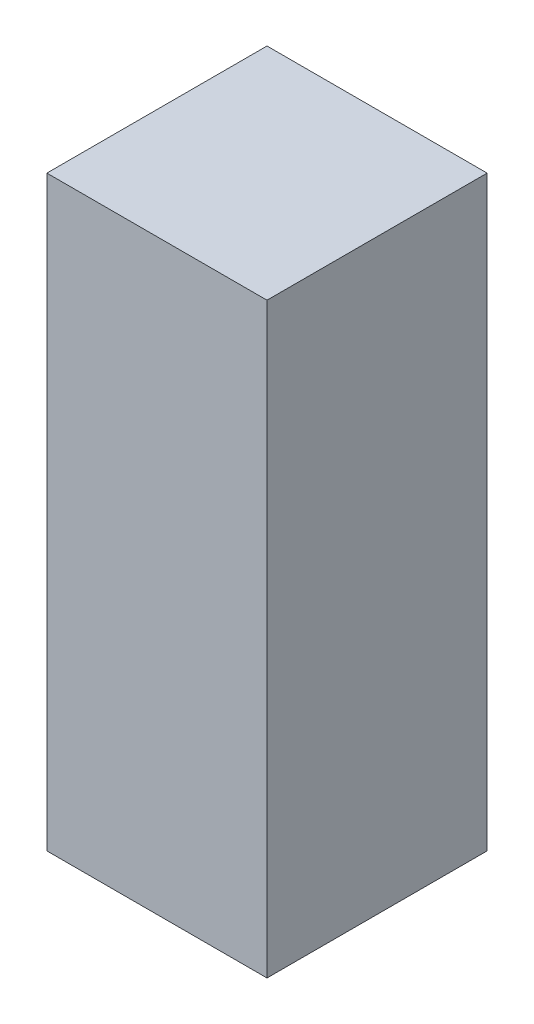
ISO-10303-21;
HEADER;
FILE_DESCRIPTION(('STEP AP214'),'2;1');
FILE_NAME('part.step','',(''),(''),'','','');
FILE_SCHEMA(('AUTOMOTIVE_DESIGN { 1 0 10303 214 1 1 1 1 }'));
ENDSEC;
DATA;
#1=APPLICATION_CONTEXT('core data for automotive mechanical design processes');
#2=APPLICATION_PROTOCOL_DEFINITION('international standard','automotive_design',2000,#1);
#3=PRODUCT_CONTEXT('',#1,'mechanical');
#4=PRODUCT('Part','Part','',(#3));
#5=PRODUCT_RELATED_PRODUCT_CATEGORY('part','',(#4));
#6=PRODUCT_DEFINITION_FORMATION('','',#4);
#7=PRODUCT_DEFINITION_CONTEXT('part definition',#1,'design');
#8=PRODUCT_DEFINITION('design','',#6,#7);
#9=PRODUCT_DEFINITION_SHAPE('','',#8);
#10=(LENGTH_UNIT() NAMED_UNIT(*) SI_UNIT(.MILLI.,.METRE.));
#11=(NAMED_UNIT(*) PLANE_ANGLE_UNIT() SI_UNIT($,.RADIAN.));
#12=(NAMED_UNIT(*) SI_UNIT($,.STERADIAN.) SOLID_ANGLE_UNIT());
#13=UNCERTAINTY_MEASURE_WITH_UNIT(LENGTH_MEASURE(1.E-05),#10,'distance_accuracy_value','');
#14=(GEOMETRIC_REPRESENTATION_CONTEXT(3) GLOBAL_UNCERTAINTY_ASSIGNED_CONTEXT((#13)) GLOBAL_UNIT_ASSIGNED_CONTEXT((#10,
#11,#12)) REPRESENTATION_CONTEXT('',''));
#15=CARTESIAN_POINT('',(0.,0.,0.));
#16=DIRECTION('',(0.,0.,1.));
#17=DIRECTION('',(1.,0.,0.));
#18=AXIS2_PLACEMENT_3D('',#15,#16,#17);
#19=CARTESIAN_POINT('',(0.,203.2,0.));
#20=DIRECTION('',(0.,-1.,0.));
#21=DIRECTION('',(0.,0.,-1.));
#22=AXIS2_PLACEMENT_3D('',#19,#20,#21);
#23=PLANE('',#22);
#24=DIRECTION('',(0.,0.,-1.));
#25=VECTOR('',#24,1.);
#26=CARTESIAN_POINT('',(38.1,203.2,38.1));
#27=LINE('',#26,#25);
#28=CARTESIAN_POINT('',(38.1,203.2,38.1));
#29=VERTEX_POINT('',#28);
#30=CARTESIAN_POINT('',(38.1,203.2,-38.1));
#31=VERTEX_POINT('',#30);
#32=EDGE_CURVE('E134',#29,#31,#27,.T.);
#33=ORIENTED_EDGE('',*,*,#32,.T.);
#34=DIRECTION('',(-1.,0.,0.));
#35=VECTOR('',#34,1.);
#36=CARTESIAN_POINT('',(-38.1,203.2,-38.1));
#37=LINE('',#36,#35);
#38=CARTESIAN_POINT('',(-38.1,203.2,-38.1));
#39=VERTEX_POINT('',#38);
#40=EDGE_CURVE('E137',#31,#39,#37,.T.);
#41=ORIENTED_EDGE('',*,*,#40,.T.);
#42=DIRECTION('',(0.,0.,1.));
#43=VECTOR('',#42,1.);
#44=CARTESIAN_POINT('',(-38.1,203.2,38.1));
#45=LINE('',#44,#43);
#46=CARTESIAN_POINT('',(-38.1,203.2,38.1));
#47=VERTEX_POINT('',#46);
#48=EDGE_CURVE('E140',#39,#47,#45,.T.);
#49=ORIENTED_EDGE('',*,*,#48,.T.);
#50=DIRECTION('',(1.,0.,0.));
#51=VECTOR('',#50,1.);
#52=CARTESIAN_POINT('',(-38.1,203.2,38.1));
#53=LINE('',#52,#51);
#54=EDGE_CURVE('E142',#47,#29,#53,.T.);
#55=ORIENTED_EDGE('',*,*,#54,.T.);
#56=EDGE_LOOP('',(#33,#41,#49,#55));
#57=FACE_BOUND('',#56,.T.);
#58=ADVANCED_FACE('F33',(#57),#23,.F.);
#59=CARTESIAN_POINT('',(0.,0.,0.));
#60=DIRECTION('',(0.,-1.,0.));
#61=DIRECTION('',(0.,0.,-1.));
#62=AXIS2_PLACEMENT_3D('',#59,#60,#61);
#63=PLANE('',#62);
#64=DIRECTION('',(0.,0.,-1.));
#65=VECTOR('',#64,1.);
#66=CARTESIAN_POINT('',(38.1,0.,38.1));
#67=LINE('',#66,#65);
#68=CARTESIAN_POINT('',(38.1,0.,38.1));
#69=VERTEX_POINT('',#68);
#70=CARTESIAN_POINT('',(38.1,0.,-38.1));
#71=VERTEX_POINT('',#70);
#72=EDGE_CURVE('E133',#69,#71,#67,.T.);
#73=ORIENTED_EDGE('',*,*,#72,.F.);
#74=DIRECTION('',(1.,0.,0.));
#75=VECTOR('',#74,1.);
#76=CARTESIAN_POINT('',(-38.1,0.,38.1));
#77=LINE('',#76,#75);
#78=CARTESIAN_POINT('',(-38.1,0.,38.1));
#79=VERTEX_POINT('',#78);
#80=EDGE_CURVE('E138',#79,#69,#77,.T.);
#81=ORIENTED_EDGE('',*,*,#80,.F.);
#82=DIRECTION('',(0.,0.,1.));
#83=VECTOR('',#82,1.);
#84=CARTESIAN_POINT('',(-38.1,0.,38.1));
#85=LINE('',#84,#83);
#86=CARTESIAN_POINT('',(-38.1,0.,-38.1));
#87=VERTEX_POINT('',#86);
#88=EDGE_CURVE('E149',#87,#79,#85,.T.);
#89=ORIENTED_EDGE('',*,*,#88,.F.);
#90=DIRECTION('',(-1.,0.,0.));
#91=VECTOR('',#90,1.);
#92=CARTESIAN_POINT('',(-38.1,0.,-38.1));
#93=LINE('',#92,#91);
#94=EDGE_CURVE('E147',#71,#87,#93,.T.);
#95=ORIENTED_EDGE('',*,*,#94,.F.);
#96=EDGE_LOOP('',(#73,#81,#89,#95));
#97=FACE_BOUND('',#96,.T.);
#98=DIRECTION('',(1.,0.,0.));
#99=VECTOR('',#98,1.);
#100=CARTESIAN_POINT('',(-36.83,0.,36.83));
#101=LINE('',#100,#99);
#102=CARTESIAN_POINT('',(-36.83,0.,36.83));
#103=VERTEX_POINT('',#102);
#104=CARTESIAN_POINT('',(36.83,0.,36.83));
#105=VERTEX_POINT('',#104);
#106=EDGE_CURVE('E104',#103,#105,#101,.T.);
#107=ORIENTED_EDGE('',*,*,#106,.T.);
#108=DIRECTION('',(0.,0.,-1.));
#109=VECTOR('',#108,1.);
#110=CARTESIAN_POINT('',(36.83,0.,36.83));
#111=LINE('',#110,#109);
#112=CARTESIAN_POINT('',(36.83,0.,-36.83));
#113=VERTEX_POINT('',#112);
#114=EDGE_CURVE('E117',#105,#113,#111,.T.);
#115=ORIENTED_EDGE('',*,*,#114,.T.);
#116=DIRECTION('',(-1.,0.,0.));
#117=VECTOR('',#116,1.);
#118=CARTESIAN_POINT('',(-36.83,0.,-36.83));
#119=LINE('',#118,#117);
#120=CARTESIAN_POINT('',(-36.83,0.,-36.83));
#121=VERTEX_POINT('',#120);
#122=EDGE_CURVE('E120',#113,#121,#119,.T.);
#123=ORIENTED_EDGE('',*,*,#122,.T.);
#124=DIRECTION('',(0.,0.,1.));
#125=VECTOR('',#124,1.);
#126=CARTESIAN_POINT('',(-36.83,0.,36.83));
#127=LINE('',#126,#125);
#128=EDGE_CURVE('E126',#121,#103,#127,.T.);
#129=ORIENTED_EDGE('',*,*,#128,.T.);
#130=EDGE_LOOP('',(#107,#115,#123,#129));
#131=FACE_BOUND('',#130,.T.);
#132=ADVANCED_FACE('F167',(#97,#131),#63,.T.);
#133=CARTESIAN_POINT('',(38.1,203.2,38.1));
#134=DIRECTION('',(-1.,0.,0.));
#135=DIRECTION('',(0.,0.,1.));
#136=AXIS2_PLACEMENT_3D('',#133,#134,#135);
#137=PLANE('',#136);
#138=ORIENTED_EDGE('',*,*,#72,.T.);
#139=DIRECTION('',(0.,-1.,0.));
#140=VECTOR('',#139,1.);
#141=CARTESIAN_POINT('',(38.1,203.2,-38.1));
#142=LINE('',#141,#140);
#143=EDGE_CURVE('E11',#31,#71,#142,.T.);
#144=ORIENTED_EDGE('',*,*,#143,.F.);
#145=ORIENTED_EDGE('',*,*,#32,.F.);
#146=DIRECTION('',(0.,-1.,0.));
#147=VECTOR('',#146,1.);
#148=CARTESIAN_POINT('',(38.1,203.2,38.1));
#149=LINE('',#148,#147);
#150=EDGE_CURVE('E144',#29,#69,#149,.T.);
#151=ORIENTED_EDGE('',*,*,#150,.T.);
#152=EDGE_LOOP('',(#138,#144,#145,#151));
#153=FACE_BOUND('',#152,.T.);
#154=ADVANCED_FACE('F35',(#153),#137,.F.);
#155=CARTESIAN_POINT('',(-38.1,203.2,-38.1));
#156=DIRECTION('',(0.,0.,1.));
#157=DIRECTION('',(1.,0.,0.));
#158=AXIS2_PLACEMENT_3D('',#155,#156,#157);
#159=PLANE('',#158);
#160=ORIENTED_EDGE('',*,*,#94,.T.);
#161=DIRECTION('',(0.,-1.,0.));
#162=VECTOR('',#161,1.);
#163=CARTESIAN_POINT('',(-38.1,203.2,-38.1));
#164=LINE('',#163,#162);
#165=EDGE_CURVE('E41',#39,#87,#164,.T.);
#166=ORIENTED_EDGE('',*,*,#165,.F.);
#167=ORIENTED_EDGE('',*,*,#40,.F.);
#168=ORIENTED_EDGE('',*,*,#143,.T.);
#169=EDGE_LOOP('',(#160,#166,#167,#168));
#170=FACE_BOUND('',#169,.T.);
#171=ADVANCED_FACE('F177',(#170),#159,.F.);
#172=CARTESIAN_POINT('',(-38.1,203.2,38.1));
#173=DIRECTION('',(1.,0.,0.));
#174=DIRECTION('',(0.,0.,-1.));
#175=AXIS2_PLACEMENT_3D('',#172,#173,#174);
#176=PLANE('',#175);
#177=ORIENTED_EDGE('',*,*,#88,.T.);
#178=DIRECTION('',(0.,-1.,0.));
#179=VECTOR('',#178,1.);
#180=CARTESIAN_POINT('',(-38.1,203.2,38.1));
#181=LINE('',#180,#179);
#182=EDGE_CURVE('E154',#47,#79,#181,.T.);
#183=ORIENTED_EDGE('',*,*,#182,.F.);
#184=ORIENTED_EDGE('',*,*,#48,.F.);
#185=ORIENTED_EDGE('',*,*,#165,.T.);
#186=EDGE_LOOP('',(#177,#183,#184,#185));
#187=FACE_BOUND('',#186,.T.);
#188=ADVANCED_FACE('F161',(#187),#176,.F.);
#189=CARTESIAN_POINT('',(-38.1,203.2,38.1));
#190=DIRECTION('',(0.,0.,-1.));
#191=DIRECTION('',(-1.,0.,0.));
#192=AXIS2_PLACEMENT_3D('',#189,#190,#191);
#193=PLANE('',#192);
#194=ORIENTED_EDGE('',*,*,#80,.T.);
#195=ORIENTED_EDGE('',*,*,#150,.F.);
#196=ORIENTED_EDGE('',*,*,#54,.F.);
#197=ORIENTED_EDGE('',*,*,#182,.T.);
#198=EDGE_LOOP('',(#194,#195,#196,#197));
#199=FACE_BOUND('',#198,.T.);
#200=ADVANCED_FACE('F171',(#199),#193,.F.);
#201=CARTESIAN_POINT('',(36.83,203.2,36.83));
#202=DIRECTION('',(-1.,0.,0.));
#203=DIRECTION('',(0.,0.,1.));
#204=AXIS2_PLACEMENT_3D('',#201,#202,#203);
#205=PLANE('',#204);
#206=DIRECTION('',(0.,0.,-1.));
#207=VECTOR('',#206,1.);
#208=CARTESIAN_POINT('',(36.83,201.93,36.83));
#209=LINE('',#208,#207);
#210=CARTESIAN_POINT('',(36.83,201.93,36.83));
#211=VERTEX_POINT('',#210);
#212=CARTESIAN_POINT('',(36.83,201.93,-36.83));
#213=VERTEX_POINT('',#212);
#214=EDGE_CURVE('E48',#211,#213,#209,.T.);
#215=ORIENTED_EDGE('',*,*,#214,.T.);
#216=DIRECTION('',(0.,-1.,0.));
#217=VECTOR('',#216,1.);
#218=CARTESIAN_POINT('',(36.83,203.2,-36.83));
#219=LINE('',#218,#217);
#220=EDGE_CURVE('E131',#213,#113,#219,.T.);
#221=ORIENTED_EDGE('',*,*,#220,.T.);
#222=ORIENTED_EDGE('',*,*,#114,.F.);
#223=DIRECTION('',(0.,-1.,0.));
#224=VECTOR('',#223,1.);
#225=CARTESIAN_POINT('',(36.83,203.2,36.83));
#226=LINE('',#225,#224);
#227=EDGE_CURVE('E109',#211,#105,#226,.T.);
#228=ORIENTED_EDGE('',*,*,#227,.F.);
#229=EDGE_LOOP('',(#215,#221,#222,#228));
#230=FACE_BOUND('',#229,.T.);
#231=ADVANCED_FACE('F191',(#230),#205,.T.);
#232=CARTESIAN_POINT('',(-36.83,203.2,-36.83));
#233=DIRECTION('',(0.,0.,1.));
#234=DIRECTION('',(1.,0.,0.));
#235=AXIS2_PLACEMENT_3D('',#232,#233,#234);
#236=PLANE('',#235);
#237=DIRECTION('',(-1.,0.,0.));
#238=VECTOR('',#237,1.);
#239=CARTESIAN_POINT('',(-36.83,201.93,-36.83));
#240=LINE('',#239,#238);
#241=CARTESIAN_POINT('',(-36.83,201.93,-36.83));
#242=VERTEX_POINT('',#241);
#243=EDGE_CURVE('E55',#213,#242,#240,.T.);
#244=ORIENTED_EDGE('',*,*,#243,.T.);
#245=DIRECTION('',(0.,-1.,0.));
#246=VECTOR('',#245,1.);
#247=CARTESIAN_POINT('',(-36.83,203.2,-36.83));
#248=LINE('',#247,#246);
#249=EDGE_CURVE('E108',#242,#121,#248,.T.);
#250=ORIENTED_EDGE('',*,*,#249,.T.);
#251=ORIENTED_EDGE('',*,*,#122,.F.);
#252=ORIENTED_EDGE('',*,*,#220,.F.);
#253=EDGE_LOOP('',(#244,#250,#251,#252));
#254=FACE_BOUND('',#253,.T.);
#255=ADVANCED_FACE('F198',(#254),#236,.T.);
#256=CARTESIAN_POINT('',(-36.83,203.2,36.83));
#257=DIRECTION('',(1.,0.,0.));
#258=DIRECTION('',(0.,0.,-1.));
#259=AXIS2_PLACEMENT_3D('',#256,#257,#258);
#260=PLANE('',#259);
#261=DIRECTION('',(0.,0.,1.));
#262=VECTOR('',#261,1.);
#263=CARTESIAN_POINT('',(-36.83,201.93,36.83));
#264=LINE('',#263,#262);
#265=CARTESIAN_POINT('',(-36.83,201.93,36.83));
#266=VERTEX_POINT('',#265);
#267=EDGE_CURVE('E112',#242,#266,#264,.T.);
#268=ORIENTED_EDGE('',*,*,#267,.T.);
#269=DIRECTION('',(0.,-1.,0.));
#270=VECTOR('',#269,1.);
#271=CARTESIAN_POINT('',(-36.83,203.2,36.83));
#272=LINE('',#271,#270);
#273=EDGE_CURVE('E98',#266,#103,#272,.T.);
#274=ORIENTED_EDGE('',*,*,#273,.T.);
#275=ORIENTED_EDGE('',*,*,#128,.F.);
#276=ORIENTED_EDGE('',*,*,#249,.F.);
#277=EDGE_LOOP('',(#268,#274,#275,#276));
#278=FACE_BOUND('',#277,.T.);
#279=ADVANCED_FACE('F113',(#278),#260,.T.);
#280=CARTESIAN_POINT('',(-36.83,203.2,36.83));
#281=DIRECTION('',(0.,0.,-1.));
#282=DIRECTION('',(-1.,0.,0.));
#283=AXIS2_PLACEMENT_3D('',#280,#281,#282);
#284=PLANE('',#283);
#285=DIRECTION('',(1.,0.,0.));
#286=VECTOR('',#285,1.);
#287=CARTESIAN_POINT('',(-36.83,201.93,36.83));
#288=LINE('',#287,#286);
#289=EDGE_CURVE('E102',#266,#211,#288,.T.);
#290=ORIENTED_EDGE('',*,*,#289,.T.);
#291=ORIENTED_EDGE('',*,*,#227,.T.);
#292=ORIENTED_EDGE('',*,*,#106,.F.);
#293=ORIENTED_EDGE('',*,*,#273,.F.);
#294=EDGE_LOOP('',(#290,#291,#292,#293));
#295=FACE_BOUND('',#294,.T.);
#296=ADVANCED_FACE('F100',(#295),#284,.T.);
#297=CARTESIAN_POINT('',(0.,201.93,0.));
#298=DIRECTION('',(0.,-1.,0.));
#299=DIRECTION('',(0.,0.,-1.));
#300=AXIS2_PLACEMENT_3D('',#297,#298,#299);
#301=PLANE('',#300);
#302=ORIENTED_EDGE('',*,*,#214,.F.);
#303=ORIENTED_EDGE('',*,*,#289,.F.);
#304=ORIENTED_EDGE('',*,*,#267,.F.);
#305=ORIENTED_EDGE('',*,*,#243,.F.);
#306=EDGE_LOOP('',(#302,#303,#304,#305));
#307=FACE_BOUND('',#306,.T.);
#308=ADVANCED_FACE('F116',(#307),#301,.T.);
#309=CLOSED_SHELL('',(#58,#132,#154,#171,#188,#200,#231,#255,#279,#296,#308));
#310=MANIFOLD_SOLID_BREP('B2',#309);
#311=ADVANCED_BREP_SHAPE_REPRESENTATION('',(#18,#310),#14);
#312=SHAPE_DEFINITION_REPRESENTATION(#9,#311);
ENDSEC;
END-ISO-10303-21;
